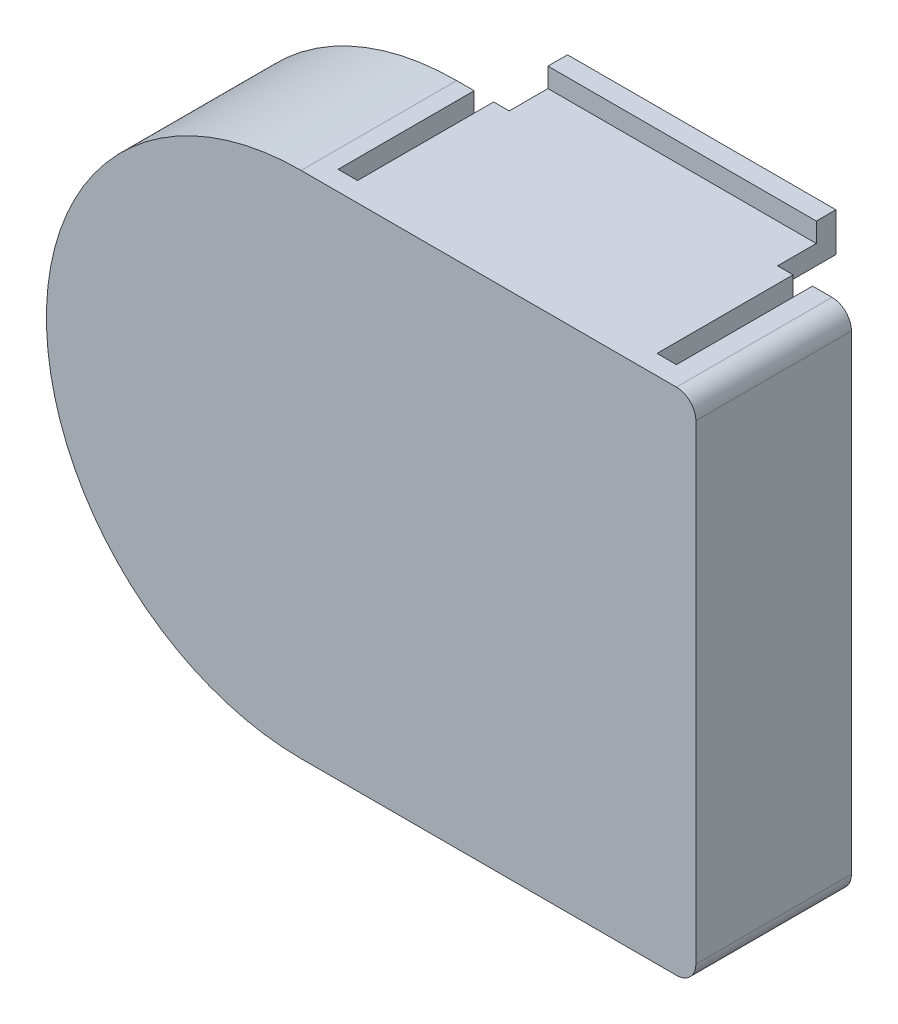
ISO-10303-21;
HEADER;
FILE_DESCRIPTION(('STEP AP214'),'2;1');
FILE_NAME('part.step','',(''),(''),'','','');
FILE_SCHEMA(('AUTOMOTIVE_DESIGN { 1 0 10303 214 1 1 1 1 }'));
ENDSEC;
DATA;
#1=APPLICATION_CONTEXT('core data for automotive mechanical design processes');
#2=APPLICATION_PROTOCOL_DEFINITION('international standard','automotive_design',2000,#1);
#3=PRODUCT_CONTEXT('',#1,'mechanical');
#4=PRODUCT('Part','Part','',(#3));
#5=PRODUCT_RELATED_PRODUCT_CATEGORY('part','',(#4));
#6=PRODUCT_DEFINITION_FORMATION('','',#4);
#7=PRODUCT_DEFINITION_CONTEXT('part definition',#1,'design');
#8=PRODUCT_DEFINITION('design','',#6,#7);
#9=PRODUCT_DEFINITION_SHAPE('','',#8);
#10=(LENGTH_UNIT() NAMED_UNIT(*) SI_UNIT(.MILLI.,.METRE.));
#11=(NAMED_UNIT(*) PLANE_ANGLE_UNIT() SI_UNIT($,.RADIAN.));
#12=(NAMED_UNIT(*) SI_UNIT($,.STERADIAN.) SOLID_ANGLE_UNIT());
#13=UNCERTAINTY_MEASURE_WITH_UNIT(LENGTH_MEASURE(1.E-05),#10,'distance_accuracy_value','');
#14=(GEOMETRIC_REPRESENTATION_CONTEXT(3) GLOBAL_UNCERTAINTY_ASSIGNED_CONTEXT((#13)) GLOBAL_UNIT_ASSIGNED_CONTEXT((#10,
#11,#12)) REPRESENTATION_CONTEXT('',''));
#15=CARTESIAN_POINT('',(0.,0.,0.));
#16=DIRECTION('',(0.,0.,1.));
#17=DIRECTION('',(1.,0.,0.));
#18=AXIS2_PLACEMENT_3D('',#15,#16,#17);
#19=CARTESIAN_POINT('',(21.209,16.637,22.86));
#20=DIRECTION('',(1.,0.,0.));
#21=DIRECTION('',(0.,0.,-1.));
#22=AXIS2_PLACEMENT_3D('',#19,#20,#21);
#23=PLANE('',#22);
#24=DIRECTION('',(0.,0.,-1.));
#25=VECTOR('',#24,1.);
#26=CARTESIAN_POINT('',(21.209,15.367,22.86));
#27=LINE('',#26,#25);
#28=CARTESIAN_POINT('',(21.209,15.367,10.16));
#29=VERTEX_POINT('',#28);
#30=CARTESIAN_POINT('',(21.209,15.367,20.32));
#31=VERTEX_POINT('',#30);
#32=EDGE_CURVE('E299',#29,#31,#27,.F.);
#33=ORIENTED_EDGE('',*,*,#32,.T.);
#34=DIRECTION('',(0.,-1.,0.));
#35=VECTOR('',#34,1.);
#36=CARTESIAN_POINT('',(21.209,16.637,20.32));
#37=LINE('',#36,#35);
#38=CARTESIAN_POINT('',(21.209,-15.367,20.32));
#39=VERTEX_POINT('',#38);
#40=EDGE_CURVE('E50',#31,#39,#37,.T.);
#41=ORIENTED_EDGE('',*,*,#40,.T.);
#42=DIRECTION('',(0.,0.,-1.));
#43=VECTOR('',#42,1.);
#44=CARTESIAN_POINT('',(21.209,-15.367,22.86));
#45=LINE('',#44,#43);
#46=CARTESIAN_POINT('',(21.209,-15.367,10.16));
#47=VERTEX_POINT('',#46);
#48=EDGE_CURVE('E297',#39,#47,#45,.T.);
#49=ORIENTED_EDGE('',*,*,#48,.T.);
#50=DIRECTION('',(0.,-1.,0.));
#51=VECTOR('',#50,1.);
#52=CARTESIAN_POINT('',(21.209,16.637,10.16));
#53=LINE('',#52,#51);
#54=EDGE_CURVE('E366',#29,#47,#53,.T.);
#55=ORIENTED_EDGE('',*,*,#54,.F.);
#56=EDGE_LOOP('',(#33,#41,#49,#55));
#57=FACE_BOUND('',#56,.T.);
#58=ADVANCED_FACE('F35',(#57),#23,.T.);
#59=CARTESIAN_POINT('',(21.209,16.637,22.86));
#60=DIRECTION('',(0.,1.,0.));
#61=DIRECTION('',(0.,0.,1.));
#62=AXIS2_PLACEMENT_3D('',#59,#60,#61);
#63=PLANE('',#62);
#64=DIRECTION('',(0.,0.,-1.));
#65=VECTOR('',#64,1.);
#66=CARTESIAN_POINT('',(-4.57200000000006,16.637,22.86));
#67=LINE('',#66,#65);
#68=CARTESIAN_POINT('',(-4.57200000000006,16.637,20.32));
#69=VERTEX_POINT('',#68);
#70=CARTESIAN_POINT('',(-4.57200000000006,16.637,10.16));
#71=VERTEX_POINT('',#70);
#72=EDGE_CURVE('E286',#69,#71,#67,.T.);
#73=ORIENTED_EDGE('',*,*,#72,.F.);
#74=DIRECTION('',(1.,0.,0.));
#75=VECTOR('',#74,1.);
#76=CARTESIAN_POINT('',(21.209,16.637,20.32));
#77=LINE('',#76,#75);
#78=CARTESIAN_POINT('',(19.939,16.637,20.32));
#79=VERTEX_POINT('',#78);
#80=EDGE_CURVE('E278',#69,#79,#77,.T.);
#81=ORIENTED_EDGE('',*,*,#80,.T.);
#82=DIRECTION('',(0.,0.,-1.));
#83=VECTOR('',#82,1.);
#84=CARTESIAN_POINT('',(19.939,16.637,22.86));
#85=LINE('',#84,#83);
#86=CARTESIAN_POINT('',(19.939,16.637,10.16));
#87=VERTEX_POINT('',#86);
#88=EDGE_CURVE('E43',#79,#87,#85,.T.);
#89=ORIENTED_EDGE('',*,*,#88,.T.);
#90=DIRECTION('',(1.,0.,0.));
#91=VECTOR('',#90,1.);
#92=CARTESIAN_POINT('',(21.209,16.637,10.16));
#93=LINE('',#92,#91);
#94=CARTESIAN_POINT('',(18.669,16.637,10.16));
#95=VERTEX_POINT('',#94);
#96=EDGE_CURVE('E360',#95,#87,#93,.T.);
#97=ORIENTED_EDGE('',*,*,#96,.F.);
#98=DIRECTION('',(0.,0.,-1.));
#99=VECTOR('',#98,1.);
#100=CARTESIAN_POINT('',(18.669,16.637,22.86));
#101=LINE('',#100,#99);
#102=CARTESIAN_POINT('',(18.669,16.637,19.05));
#103=VERTEX_POINT('',#102);
#104=EDGE_CURVE('E466',#103,#95,#101,.T.);
#105=ORIENTED_EDGE('',*,*,#104,.F.);
#106=DIRECTION('',(1.,0.,0.));
#107=VECTOR('',#106,1.);
#108=CARTESIAN_POINT('',(21.209,16.637,19.05));
#109=LINE('',#108,#107);
#110=CARTESIAN_POINT('',(17.399,16.637,19.05));
#111=VERTEX_POINT('',#110);
#112=EDGE_CURVE('E438',#111,#103,#109,.T.);
#113=ORIENTED_EDGE('',*,*,#112,.F.);
#114=DIRECTION('',(0.,0.,1.));
#115=VECTOR('',#114,1.);
#116=CARTESIAN_POINT('',(17.399,16.637,22.86));
#117=LINE('',#116,#115);
#118=CARTESIAN_POINT('',(17.399,16.637,10.16));
#119=VERTEX_POINT('',#118);
#120=EDGE_CURVE('E456',#119,#111,#117,.T.);
#121=ORIENTED_EDGE('',*,*,#120,.F.);
#122=CARTESIAN_POINT('',(16.3829999999999,16.637,10.16));
#123=VERTEX_POINT('',#122);
#124=EDGE_CURVE('E356',#123,#119,#93,.T.);
#125=ORIENTED_EDGE('',*,*,#124,.F.);
#126=DIRECTION('',(0.,0.,-1.));
#127=VECTOR('',#126,1.);
#128=CARTESIAN_POINT('',(16.3829999999999,16.637,0.));
#129=LINE('',#128,#127);
#130=CARTESIAN_POINT('',(16.3829999999999,16.637,7.62868518843452));
#131=VERTEX_POINT('',#130);
#132=EDGE_CURVE('E429',#123,#131,#129,.T.);
#133=ORIENTED_EDGE('',*,*,#132,.T.);
#134=DIRECTION('',(1.,0.,0.));
#135=VECTOR('',#134,1.);
#136=CARTESIAN_POINT('',(-1.14300000000005,16.637,7.62868518843452));
#137=LINE('',#136,#135);
#138=CARTESIAN_POINT('',(-1.14300000000005,16.637,7.62868518843452));
#139=VERTEX_POINT('',#138);
#140=EDGE_CURVE('E397',#139,#131,#137,.T.);
#141=ORIENTED_EDGE('',*,*,#140,.F.);
#142=DIRECTION('',(0.,0.,-1.));
#143=VECTOR('',#142,1.);
#144=CARTESIAN_POINT('',(-1.14300000000005,16.637,0.));
#145=LINE('',#144,#143);
#146=CARTESIAN_POINT('',(-1.14300000000005,16.637,10.16));
#147=VERTEX_POINT('',#146);
#148=EDGE_CURVE('E446',#147,#139,#145,.T.);
#149=ORIENTED_EDGE('',*,*,#148,.F.);
#150=CARTESIAN_POINT('',(-2.15900000000003,16.637,10.16));
#151=VERTEX_POINT('',#150);
#152=EDGE_CURVE('E355',#151,#147,#93,.T.);
#153=ORIENTED_EDGE('',*,*,#152,.F.);
#154=DIRECTION('',(0.,0.,-1.));
#155=VECTOR('',#154,1.);
#156=CARTESIAN_POINT('',(-2.15900000000003,16.637,22.86));
#157=LINE('',#156,#155);
#158=CARTESIAN_POINT('',(-2.15900000000003,16.637,19.05));
#159=VERTEX_POINT('',#158);
#160=EDGE_CURVE('E506',#159,#151,#157,.T.);
#161=ORIENTED_EDGE('',*,*,#160,.F.);
#162=DIRECTION('',(1.,0.,0.));
#163=VECTOR('',#162,1.);
#164=CARTESIAN_POINT('',(21.209,16.637,19.05));
#165=LINE('',#164,#163);
#166=CARTESIAN_POINT('',(-3.42900000000003,16.637,19.05));
#167=VERTEX_POINT('',#166);
#168=EDGE_CURVE('E488',#167,#159,#165,.T.);
#169=ORIENTED_EDGE('',*,*,#168,.F.);
#170=DIRECTION('',(0.,0.,1.));
#171=VECTOR('',#170,1.);
#172=CARTESIAN_POINT('',(-3.42900000000003,16.637,22.86));
#173=LINE('',#172,#171);
#174=CARTESIAN_POINT('',(-3.42900000000003,16.637,10.16));
#175=VERTEX_POINT('',#174);
#176=EDGE_CURVE('E497',#175,#167,#173,.T.);
#177=ORIENTED_EDGE('',*,*,#176,.F.);
#178=EDGE_CURVE('E351',#71,#175,#93,.T.);
#179=ORIENTED_EDGE('',*,*,#178,.F.);
#180=EDGE_LOOP('',(#73,#81,#89,#97,#105,#113,#121,#125,#133,#141,#149,#153,#161,#169,#177,#179));
#181=FACE_BOUND('',#180,.T.);
#182=ADVANCED_FACE('F284',(#181),#63,.T.);
#183=CARTESIAN_POINT('',(-4.572,0.,22.86));
#184=DIRECTION('',(0.,0.,-1.));
#185=DIRECTION('',(-1.,0.,0.));
#186=AXIS2_PLACEMENT_3D('',#183,#184,#185);
#187=CYLINDRICAL_SURFACE('',#186,16.637);
#188=DIRECTION('',(0.,0.,-1.));
#189=VECTOR('',#188,1.);
#190=CARTESIAN_POINT('',(-4.57199999999979,-16.637,22.86));
#191=LINE('',#190,#189);
#192=CARTESIAN_POINT('',(-4.57199999999979,-16.637,20.32));
#193=VERTEX_POINT('',#192);
#194=CARTESIAN_POINT('',(-4.57199999999979,-16.637,10.16));
#195=VERTEX_POINT('',#194);
#196=EDGE_CURVE('E349',#193,#195,#191,.T.);
#197=ORIENTED_EDGE('',*,*,#196,.F.);
#198=CARTESIAN_POINT('',(-4.572,0.,20.32));
#199=DIRECTION('',(0.,0.,1.));
#200=DIRECTION('',(1.,0.,0.));
#201=AXIS2_PLACEMENT_3D('',#198,#199,#200);
#202=CIRCLE('',#201,16.637);
#203=EDGE_CURVE('E522',#193,#69,#202,.F.);
#204=ORIENTED_EDGE('',*,*,#203,.T.);
#205=ORIENTED_EDGE('',*,*,#72,.T.);
#206=CARTESIAN_POINT('',(-4.572,0.,10.16));
#207=DIRECTION('',(0.,0.,-1.));
#208=DIRECTION('',(-1.,0.,0.));
#209=AXIS2_PLACEMENT_3D('',#206,#207,#208);
#210=CIRCLE('',#209,16.637);
#211=EDGE_CURVE('E357',#195,#71,#210,.T.);
#212=ORIENTED_EDGE('',*,*,#211,.F.);
#213=EDGE_LOOP('',(#197,#204,#205,#212));
#214=FACE_BOUND('',#213,.T.);
#215=ADVANCED_FACE('F624',(#214),#187,.T.);
#216=CARTESIAN_POINT('',(21.209,-16.637,22.86));
#217=DIRECTION('',(0.,-1.,0.));
#218=DIRECTION('',(0.,0.,-1.));
#219=AXIS2_PLACEMENT_3D('',#216,#217,#218);
#220=PLANE('',#219);
#221=DIRECTION('',(0.,0.,-1.));
#222=VECTOR('',#221,1.);
#223=CARTESIAN_POINT('',(19.939,-16.637,22.86));
#224=LINE('',#223,#222);
#225=CARTESIAN_POINT('',(19.939,-16.637,10.16));
#226=VERTEX_POINT('',#225);
#227=CARTESIAN_POINT('',(19.939,-16.637,20.32));
#228=VERTEX_POINT('',#227);
#229=EDGE_CURVE('E290',#226,#228,#224,.F.);
#230=ORIENTED_EDGE('',*,*,#229,.T.);
#231=DIRECTION('',(-1.,0.,0.));
#232=VECTOR('',#231,1.);
#233=CARTESIAN_POINT('',(21.209,-16.637,20.32));
#234=LINE('',#233,#232);
#235=EDGE_CURVE('E526',#228,#193,#234,.T.);
#236=ORIENTED_EDGE('',*,*,#235,.T.);
#237=ORIENTED_EDGE('',*,*,#196,.T.);
#238=DIRECTION('',(-1.,0.,0.));
#239=VECTOR('',#238,1.);
#240=CARTESIAN_POINT('',(21.209,-16.637,10.16));
#241=LINE('',#240,#239);
#242=CARTESIAN_POINT('',(-3.42900000000003,-16.637,10.16));
#243=VERTEX_POINT('',#242);
#244=EDGE_CURVE('E364',#243,#195,#241,.T.);
#245=ORIENTED_EDGE('',*,*,#244,.F.);
#246=DIRECTION('',(0.,0.,-1.));
#247=VECTOR('',#246,1.);
#248=CARTESIAN_POINT('',(-3.42900000000003,-16.637,22.86));
#249=LINE('',#248,#247);
#250=CARTESIAN_POINT('',(-3.42900000000003,-16.637,19.05));
#251=VERTEX_POINT('',#250);
#252=EDGE_CURVE('E499',#251,#243,#249,.T.);
#253=ORIENTED_EDGE('',*,*,#252,.F.);
#254=DIRECTION('',(-1.,0.,0.));
#255=VECTOR('',#254,1.);
#256=CARTESIAN_POINT('',(21.209,-16.637,19.05));
#257=LINE('',#256,#255);
#258=CARTESIAN_POINT('',(-2.15900000000003,-16.637,19.05));
#259=VERTEX_POINT('',#258);
#260=EDGE_CURVE('E301',#259,#251,#257,.T.);
#261=ORIENTED_EDGE('',*,*,#260,.F.);
#262=DIRECTION('',(0.,0.,1.));
#263=VECTOR('',#262,1.);
#264=CARTESIAN_POINT('',(-2.15900000000003,-16.637,22.86));
#265=LINE('',#264,#263);
#266=CARTESIAN_POINT('',(-2.15900000000003,-16.637,10.16));
#267=VERTEX_POINT('',#266);
#268=EDGE_CURVE('E508',#267,#259,#265,.T.);
#269=ORIENTED_EDGE('',*,*,#268,.F.);
#270=CARTESIAN_POINT('',(-1.14300000000003,-16.637,10.16));
#271=VERTEX_POINT('',#270);
#272=EDGE_CURVE('E365',#271,#267,#241,.T.);
#273=ORIENTED_EDGE('',*,*,#272,.F.);
#274=DIRECTION('',(0.,0.,-1.));
#275=VECTOR('',#274,1.);
#276=CARTESIAN_POINT('',(-1.14300000000003,-16.637,0.));
#277=LINE('',#276,#275);
#278=CARTESIAN_POINT('',(-1.14300000000003,-16.637,7.62868518843452));
#279=VERTEX_POINT('',#278);
#280=EDGE_CURVE('E402',#271,#279,#277,.T.);
#281=ORIENTED_EDGE('',*,*,#280,.T.);
#282=DIRECTION('',(1.,0.,0.));
#283=VECTOR('',#282,1.);
#284=CARTESIAN_POINT('',(-1.14300000000003,-16.637,7.62868518843452));
#285=LINE('',#284,#283);
#286=CARTESIAN_POINT('',(16.383,-16.637,7.62868518843452));
#287=VERTEX_POINT('',#286);
#288=EDGE_CURVE('E374',#279,#287,#285,.T.);
#289=ORIENTED_EDGE('',*,*,#288,.T.);
#290=DIRECTION('',(0.,0.,-1.));
#291=VECTOR('',#290,1.);
#292=CARTESIAN_POINT('',(16.383,-16.637,0.));
#293=LINE('',#292,#291);
#294=CARTESIAN_POINT('',(16.383,-16.637,10.16));
#295=VERTEX_POINT('',#294);
#296=EDGE_CURVE('E386',#295,#287,#293,.T.);
#297=ORIENTED_EDGE('',*,*,#296,.F.);
#298=CARTESIAN_POINT('',(17.399,-16.637,10.16));
#299=VERTEX_POINT('',#298);
#300=EDGE_CURVE('E363',#299,#295,#241,.T.);
#301=ORIENTED_EDGE('',*,*,#300,.F.);
#302=DIRECTION('',(0.,0.,-1.));
#303=VECTOR('',#302,1.);
#304=CARTESIAN_POINT('',(17.399,-16.637,22.86));
#305=LINE('',#304,#303);
#306=CARTESIAN_POINT('',(17.399,-16.637,19.05));
#307=VERTEX_POINT('',#306);
#308=EDGE_CURVE('E458',#307,#299,#305,.T.);
#309=ORIENTED_EDGE('',*,*,#308,.F.);
#310=DIRECTION('',(-1.,0.,0.));
#311=VECTOR('',#310,1.);
#312=CARTESIAN_POINT('',(21.209,-16.637,19.05));
#313=LINE('',#312,#311);
#314=CARTESIAN_POINT('',(18.669,-16.637,19.05));
#315=VERTEX_POINT('',#314);
#316=EDGE_CURVE('E454',#315,#307,#313,.T.);
#317=ORIENTED_EDGE('',*,*,#316,.F.);
#318=DIRECTION('',(0.,0.,1.));
#319=VECTOR('',#318,1.);
#320=CARTESIAN_POINT('',(18.669,-16.637,22.86));
#321=LINE('',#320,#319);
#322=CARTESIAN_POINT('',(18.669,-16.637,10.16));
#323=VERTEX_POINT('',#322);
#324=EDGE_CURVE('E468',#323,#315,#321,.T.);
#325=ORIENTED_EDGE('',*,*,#324,.F.);
#326=EDGE_CURVE('E361',#226,#323,#241,.T.);
#327=ORIENTED_EDGE('',*,*,#326,.F.);
#328=EDGE_LOOP('',(#230,#236,#237,#245,#253,#261,#269,#273,#281,#289,#297,#301,#309,#317,#325,#327));
#329=FACE_BOUND('',#328,.T.);
#330=ADVANCED_FACE('F628',(#329),#220,.T.);
#331=CARTESIAN_POINT('',(19.939,-15.367,22.86));
#332=DIRECTION('',(0.,0.,-1.));
#333=DIRECTION('',(-1.,0.,0.));
#334=AXIS2_PLACEMENT_3D('',#331,#332,#333);
#335=CYLINDRICAL_SURFACE('',#334,1.27);
#336=ORIENTED_EDGE('',*,*,#48,.F.);
#337=CARTESIAN_POINT('',(19.939,-15.367,20.32));
#338=DIRECTION('',(0.,0.,1.));
#339=DIRECTION('',(1.,0.,0.));
#340=AXIS2_PLACEMENT_3D('',#337,#338,#339);
#341=CIRCLE('',#340,1.27);
#342=EDGE_CURVE('E529',#39,#228,#341,.F.);
#343=ORIENTED_EDGE('',*,*,#342,.T.);
#344=ORIENTED_EDGE('',*,*,#229,.F.);
#345=CARTESIAN_POINT('',(19.939,-15.367,10.16));
#346=DIRECTION('',(0.,0.,1.));
#347=DIRECTION('',(1.,0.,0.));
#348=AXIS2_PLACEMENT_3D('',#345,#346,#347);
#349=CIRCLE('',#348,1.27);
#350=EDGE_CURVE('E292',#47,#226,#349,.F.);
#351=ORIENTED_EDGE('',*,*,#350,.F.);
#352=EDGE_LOOP('',(#336,#343,#344,#351));
#353=FACE_BOUND('',#352,.T.);
#354=ADVANCED_FACE('F537',(#353),#335,.T.);
#355=CARTESIAN_POINT('',(19.939,15.367,22.86));
#356=DIRECTION('',(0.,0.,-1.));
#357=DIRECTION('',(-1.,0.,0.));
#358=AXIS2_PLACEMENT_3D('',#355,#356,#357);
#359=CYLINDRICAL_SURFACE('',#358,1.27);
#360=ORIENTED_EDGE('',*,*,#88,.F.);
#361=CARTESIAN_POINT('',(19.939,15.367,20.32));
#362=DIRECTION('',(0.,0.,1.));
#363=DIRECTION('',(1.,0.,0.));
#364=AXIS2_PLACEMENT_3D('',#361,#362,#363);
#365=CIRCLE('',#364,1.27);
#366=EDGE_CURVE('E11',#79,#31,#365,.F.);
#367=ORIENTED_EDGE('',*,*,#366,.T.);
#368=ORIENTED_EDGE('',*,*,#32,.F.);
#369=CARTESIAN_POINT('',(19.939,15.367,10.16));
#370=DIRECTION('',(0.,0.,1.));
#371=DIRECTION('',(1.,0.,0.));
#372=AXIS2_PLACEMENT_3D('',#369,#370,#371);
#373=CIRCLE('',#372,1.27);
#374=EDGE_CURVE('E288',#87,#29,#373,.F.);
#375=ORIENTED_EDGE('',*,*,#374,.F.);
#376=EDGE_LOOP('',(#360,#367,#368,#375));
#377=FACE_BOUND('',#376,.T.);
#378=ADVANCED_FACE('F37',(#377),#359,.T.);
#379=CARTESIAN_POINT('',(0.,15.367,19.05));
#380=DIRECTION('',(0.,1.,0.));
#381=DIRECTION('',(0.,0.,1.));
#382=AXIS2_PLACEMENT_3D('',#379,#380,#381);
#383=PLANE('',#382);
#384=DIRECTION('',(1.,0.,0.));
#385=VECTOR('',#384,1.);
#386=CARTESIAN_POINT('',(0.,15.367,10.16));
#387=LINE('',#386,#385);
#388=CARTESIAN_POINT('',(-4.57200000000005,15.367,10.16));
#389=VERTEX_POINT('',#388);
#390=CARTESIAN_POINT('',(-3.42900000000003,15.367,10.16));
#391=VERTEX_POINT('',#390);
#392=EDGE_CURVE('E304',#389,#391,#387,.T.);
#393=ORIENTED_EDGE('',*,*,#392,.T.);
#394=DIRECTION('',(0.,0.,1.));
#395=VECTOR('',#394,1.);
#396=CARTESIAN_POINT('',(-3.42900000000003,15.367,19.05));
#397=LINE('',#396,#395);
#398=CARTESIAN_POINT('',(-3.42900000000003,15.367,19.05));
#399=VERTEX_POINT('',#398);
#400=EDGE_CURVE('E492',#391,#399,#397,.T.);
#401=ORIENTED_EDGE('',*,*,#400,.T.);
#402=DIRECTION('',(1.,0.,0.));
#403=VECTOR('',#402,1.);
#404=CARTESIAN_POINT('',(0.,15.367,19.05));
#405=LINE('',#404,#403);
#406=CARTESIAN_POINT('',(-4.57200000000005,15.367,19.05));
#407=VERTEX_POINT('',#406);
#408=EDGE_CURVE('E341',#407,#399,#405,.T.);
#409=ORIENTED_EDGE('',*,*,#408,.F.);
#410=DIRECTION('',(0.,0.,-1.));
#411=VECTOR('',#410,1.);
#412=CARTESIAN_POINT('',(-4.57200000000005,15.367,19.05));
#413=LINE('',#412,#411);
#414=EDGE_CURVE('E320',#407,#389,#413,.T.);
#415=ORIENTED_EDGE('',*,*,#414,.T.);
#416=EDGE_LOOP('',(#393,#401,#409,#415));
#417=FACE_BOUND('',#416,.T.);
#418=ADVANCED_FACE('F644',(#417),#383,.F.);
#419=CARTESIAN_POINT('',(0.,-15.367,19.05));
#420=DIRECTION('',(0.,1.,0.));
#421=DIRECTION('',(-1.,0.,0.));
#422=AXIS2_PLACEMENT_3D('',#419,#420,#421);
#423=PLANE('',#422);
#424=DIRECTION('',(0.,0.,1.));
#425=VECTOR('',#424,1.);
#426=CARTESIAN_POINT('',(-3.42900000000003,-15.367,19.05));
#427=LINE('',#426,#425);
#428=CARTESIAN_POINT('',(-3.42900000000003,-15.367,10.16));
#429=VERTEX_POINT('',#428);
#430=CARTESIAN_POINT('',(-3.42900000000003,-15.367,19.05));
#431=VERTEX_POINT('',#430);
#432=EDGE_CURVE('E495',#429,#431,#427,.T.);
#433=ORIENTED_EDGE('',*,*,#432,.F.);
#434=DIRECTION('',(1.,0.,0.));
#435=VECTOR('',#434,1.);
#436=CARTESIAN_POINT('',(0.,-15.367,10.16));
#437=LINE('',#436,#435);
#438=CARTESIAN_POINT('',(-4.57199999999983,-15.367,10.16));
#439=VERTEX_POINT('',#438);
#440=EDGE_CURVE('E303',#439,#429,#437,.T.);
#441=ORIENTED_EDGE('',*,*,#440,.F.);
#442=DIRECTION('',(0.,0.,-1.));
#443=VECTOR('',#442,1.);
#444=CARTESIAN_POINT('',(-4.57199999999983,-15.367,19.05));
#445=LINE('',#444,#443);
#446=CARTESIAN_POINT('',(-4.57199999999983,-15.367,19.05));
#447=VERTEX_POINT('',#446);
#448=EDGE_CURVE('E330',#447,#439,#445,.T.);
#449=ORIENTED_EDGE('',*,*,#448,.F.);
#450=DIRECTION('',(1.,0.,0.));
#451=VECTOR('',#450,1.);
#452=CARTESIAN_POINT('',(0.,-15.367,19.05));
#453=LINE('',#452,#451);
#454=EDGE_CURVE('E333',#447,#431,#453,.T.);
#455=ORIENTED_EDGE('',*,*,#454,.T.);
#456=EDGE_LOOP('',(#433,#441,#449,#455));
#457=FACE_BOUND('',#456,.T.);
#458=ADVANCED_FACE('F637',(#457),#423,.T.);
#459=CARTESIAN_POINT('',(0.,0.,10.16));
#460=DIRECTION('',(0.,0.,1.));
#461=DIRECTION('',(1.,0.,0.));
#462=AXIS2_PLACEMENT_3D('',#459,#460,#461);
#463=PLANE('',#462);
#464=ORIENTED_EDGE('',*,*,#178,.T.);
#465=DIRECTION('',(0.,1.,0.));
#466=VECTOR('',#465,1.);
#467=CARTESIAN_POINT('',(-3.42900000000003,-17.9736463919661,10.16));
#468=LINE('',#467,#466);
#469=EDGE_CURVE('E523',#391,#175,#468,.T.);
#470=ORIENTED_EDGE('',*,*,#469,.F.);
#471=ORIENTED_EDGE('',*,*,#392,.F.);
#472=CARTESIAN_POINT('',(-4.572,0.,10.16));
#473=DIRECTION('',(0.,0.,1.));
#474=DIRECTION('',(1.,0.,0.));
#475=AXIS2_PLACEMENT_3D('',#472,#473,#474);
#476=CIRCLE('',#475,15.367);
#477=EDGE_CURVE('E312',#389,#439,#476,.T.);
#478=ORIENTED_EDGE('',*,*,#477,.T.);
#479=ORIENTED_EDGE('',*,*,#440,.T.);
#480=EDGE_CURVE('E515',#243,#429,#468,.T.);
#481=ORIENTED_EDGE('',*,*,#480,.F.);
#482=ORIENTED_EDGE('',*,*,#244,.T.);
#483=ORIENTED_EDGE('',*,*,#211,.T.);
#484=EDGE_LOOP('',(#464,#470,#471,#478,#479,#481,#482,#483));
#485=FACE_BOUND('',#484,.T.);
#486=ADVANCED_FACE('F649',(#485),#463,.F.);
#487=ORIENTED_EDGE('',*,*,#272,.T.);
#488=DIRECTION('',(0.,-1.,0.));
#489=VECTOR('',#488,1.);
#490=CARTESIAN_POINT('',(-2.15900000000003,-17.9736463919661,10.16));
#491=LINE('',#490,#489);
#492=CARTESIAN_POINT('',(-2.15900000000003,-15.367,10.16));
#493=VERTEX_POINT('',#492);
#494=EDGE_CURVE('E519',#493,#267,#491,.T.);
#495=ORIENTED_EDGE('',*,*,#494,.F.);
#496=CARTESIAN_POINT('',(-1.14300000000003,-15.367,10.16));
#497=VERTEX_POINT('',#496);
#498=EDGE_CURVE('E318',#493,#497,#437,.T.);
#499=ORIENTED_EDGE('',*,*,#498,.T.);
#500=DIRECTION('',(0.,-1.,0.));
#501=VECTOR('',#500,1.);
#502=CARTESIAN_POINT('',(-1.14300000000004,0.,10.16));
#503=LINE('',#502,#501);
#504=EDGE_CURVE('E399',#497,#271,#503,.T.);
#505=ORIENTED_EDGE('',*,*,#504,.T.);
#506=EDGE_LOOP('',(#487,#495,#499,#505));
#507=FACE_BOUND('',#506,.T.);
#508=ADVANCED_FACE('F671',(#507),#463,.F.);
#509=CARTESIAN_POINT('',(16.383,-15.367,10.16));
#510=VERTEX_POINT('',#509);
#511=CARTESIAN_POINT('',(17.399,-15.367,10.16));
#512=VERTEX_POINT('',#511);
#513=EDGE_CURVE('E319',#510,#512,#437,.T.);
#514=ORIENTED_EDGE('',*,*,#513,.T.);
#515=DIRECTION('',(0.,1.,0.));
#516=VECTOR('',#515,1.);
#517=CARTESIAN_POINT('',(17.399,-17.433266047151,10.16));
#518=LINE('',#517,#516);
#519=EDGE_CURVE('E480',#299,#512,#518,.T.);
#520=ORIENTED_EDGE('',*,*,#519,.F.);
#521=ORIENTED_EDGE('',*,*,#300,.T.);
#522=DIRECTION('',(0.,-1.,0.));
#523=VECTOR('',#522,1.);
#524=CARTESIAN_POINT('',(16.383,0.,10.16));
#525=LINE('',#524,#523);
#526=EDGE_CURVE('E383',#510,#295,#525,.T.);
#527=ORIENTED_EDGE('',*,*,#526,.F.);
#528=EDGE_LOOP('',(#514,#520,#521,#527));
#529=FACE_BOUND('',#528,.T.);
#530=ADVANCED_FACE('F716',(#529),#463,.F.);
#531=ORIENTED_EDGE('',*,*,#124,.T.);
#532=CARTESIAN_POINT('',(17.399,15.367,10.16));
#533=VERTEX_POINT('',#532);
#534=EDGE_CURVE('E489',#533,#119,#518,.T.);
#535=ORIENTED_EDGE('',*,*,#534,.F.);
#536=CARTESIAN_POINT('',(16.3829999999999,15.367,10.16));
#537=VERTEX_POINT('',#536);
#538=EDGE_CURVE('E309',#537,#533,#387,.T.);
#539=ORIENTED_EDGE('',*,*,#538,.F.);
#540=DIRECTION('',(0.,1.,0.));
#541=VECTOR('',#540,1.);
#542=CARTESIAN_POINT('',(16.383,0.,10.16));
#543=LINE('',#542,#541);
#544=EDGE_CURVE('E432',#537,#123,#543,.T.);
#545=ORIENTED_EDGE('',*,*,#544,.T.);
#546=EDGE_LOOP('',(#531,#535,#539,#545));
#547=FACE_BOUND('',#546,.T.);
#548=ADVANCED_FACE('F604',(#547),#463,.F.);
#549=CARTESIAN_POINT('',(-2.15900000000003,15.367,19.05));
#550=VERTEX_POINT('',#549);
#551=CARTESIAN_POINT('',(17.399,15.367,19.05));
#552=VERTEX_POINT('',#551);
#553=EDGE_CURVE('E344',#550,#552,#405,.T.);
#554=ORIENTED_EDGE('',*,*,#553,.F.);
#555=DIRECTION('',(0.,0.,-1.));
#556=VECTOR('',#555,1.);
#557=CARTESIAN_POINT('',(-2.15900000000003,15.367,19.05));
#558=LINE('',#557,#556);
#559=CARTESIAN_POINT('',(-2.15900000000003,15.367,10.16));
#560=VERTEX_POINT('',#559);
#561=EDGE_CURVE('E501',#550,#560,#558,.T.);
#562=ORIENTED_EDGE('',*,*,#561,.T.);
#563=CARTESIAN_POINT('',(-1.14300000000005,15.367,10.16));
#564=VERTEX_POINT('',#563);
#565=EDGE_CURVE('E308',#560,#564,#387,.T.);
#566=ORIENTED_EDGE('',*,*,#565,.T.);
#567=DIRECTION('',(0.,0.,-1.));
#568=VECTOR('',#567,1.);
#569=CARTESIAN_POINT('',(-1.14300000000005,15.367,0.));
#570=LINE('',#569,#568);
#571=CARTESIAN_POINT('',(-1.14300000000005,15.367,6.35));
#572=VERTEX_POINT('',#571);
#573=EDGE_CURVE('E422',#564,#572,#570,.T.);
#574=ORIENTED_EDGE('',*,*,#573,.T.);
#575=DIRECTION('',(1.,0.,0.));
#576=VECTOR('',#575,1.);
#577=CARTESIAN_POINT('',(-1.14300000000005,15.367,6.35));
#578=LINE('',#577,#576);
#579=CARTESIAN_POINT('',(16.3829999999999,15.367,6.35));
#580=VERTEX_POINT('',#579);
#581=EDGE_CURVE('E416',#572,#580,#578,.T.);
#582=ORIENTED_EDGE('',*,*,#581,.T.);
#583=DIRECTION('',(0.,0.,-1.));
#584=VECTOR('',#583,1.);
#585=CARTESIAN_POINT('',(16.3829999999999,15.367,0.));
#586=LINE('',#585,#584);
#587=EDGE_CURVE('E435',#537,#580,#586,.T.);
#588=ORIENTED_EDGE('',*,*,#587,.F.);
#589=ORIENTED_EDGE('',*,*,#538,.T.);
#590=DIRECTION('',(0.,0.,1.));
#591=VECTOR('',#590,1.);
#592=CARTESIAN_POINT('',(17.399,15.367,19.05));
#593=LINE('',#592,#591);
#594=EDGE_CURVE('E460',#533,#552,#593,.T.);
#595=ORIENTED_EDGE('',*,*,#594,.T.);
#596=EDGE_LOOP('',(#554,#562,#566,#574,#582,#588,#589,#595));
#597=FACE_BOUND('',#596,.T.);
#598=ADVANCED_FACE('F575',(#597),#383,.F.);
#599=DIRECTION('',(0.,0.,-1.));
#600=VECTOR('',#599,1.);
#601=CARTESIAN_POINT('',(-2.15900000000003,-15.367,19.05));
#602=LINE('',#601,#600);
#603=CARTESIAN_POINT('',(-2.15900000000003,-15.367,19.05));
#604=VERTEX_POINT('',#603);
#605=EDGE_CURVE('E504',#604,#493,#602,.T.);
#606=ORIENTED_EDGE('',*,*,#605,.F.);
#607=CARTESIAN_POINT('',(17.399,-15.367,19.05));
#608=VERTEX_POINT('',#607);
#609=EDGE_CURVE('E336',#604,#608,#453,.T.);
#610=ORIENTED_EDGE('',*,*,#609,.T.);
#611=DIRECTION('',(0.,0.,1.));
#612=VECTOR('',#611,1.);
#613=CARTESIAN_POINT('',(17.399,-15.367,19.05));
#614=LINE('',#613,#612);
#615=EDGE_CURVE('E463',#512,#608,#614,.T.);
#616=ORIENTED_EDGE('',*,*,#615,.F.);
#617=ORIENTED_EDGE('',*,*,#513,.F.);
#618=DIRECTION('',(0.,0.,-1.));
#619=VECTOR('',#618,1.);
#620=CARTESIAN_POINT('',(16.383,-15.367,0.));
#621=LINE('',#620,#619);
#622=CARTESIAN_POINT('',(16.383,-15.367,6.35000000000001));
#623=VERTEX_POINT('',#622);
#624=EDGE_CURVE('E379',#510,#623,#621,.T.);
#625=ORIENTED_EDGE('',*,*,#624,.T.);
#626=DIRECTION('',(1.,0.,0.));
#627=VECTOR('',#626,1.);
#628=CARTESIAN_POINT('',(-1.14300000000003,-15.367,6.35000000000001));
#629=LINE('',#628,#627);
#630=CARTESIAN_POINT('',(-1.14300000000003,-15.367,6.35000000000001));
#631=VERTEX_POINT('',#630);
#632=EDGE_CURVE('E376',#631,#623,#629,.T.);
#633=ORIENTED_EDGE('',*,*,#632,.F.);
#634=DIRECTION('',(0.,0.,-1.));
#635=VECTOR('',#634,1.);
#636=CARTESIAN_POINT('',(-1.14300000000003,-15.367,0.));
#637=LINE('',#636,#635);
#638=EDGE_CURVE('E378',#497,#631,#637,.T.);
#639=ORIENTED_EDGE('',*,*,#638,.F.);
#640=ORIENTED_EDGE('',*,*,#498,.F.);
#641=EDGE_LOOP('',(#606,#610,#616,#617,#625,#633,#639,#640));
#642=FACE_BOUND('',#641,.T.);
#643=ADVANCED_FACE('F638',(#642),#423,.T.);
#644=ORIENTED_EDGE('',*,*,#54,.T.);
#645=ORIENTED_EDGE('',*,*,#350,.T.);
#646=ORIENTED_EDGE('',*,*,#326,.T.);
#647=DIRECTION('',(0.,-1.,0.));
#648=VECTOR('',#647,1.);
#649=CARTESIAN_POINT('',(18.669,-17.433266047151,10.16));
#650=LINE('',#649,#648);
#651=CARTESIAN_POINT('',(18.669,-15.367,10.16));
#652=VERTEX_POINT('',#651);
#653=EDGE_CURVE('E484',#652,#323,#650,.T.);
#654=ORIENTED_EDGE('',*,*,#653,.F.);
#655=CARTESIAN_POINT('',(19.939,-15.367,10.16));
#656=VERTEX_POINT('',#655);
#657=EDGE_CURVE('E315',#652,#656,#437,.T.);
#658=ORIENTED_EDGE('',*,*,#657,.T.);
#659=DIRECTION('',(0.,-1.,0.));
#660=VECTOR('',#659,1.);
#661=CARTESIAN_POINT('',(19.939,0.,10.16));
#662=LINE('',#661,#660);
#663=CARTESIAN_POINT('',(19.939,15.367,10.16));
#664=VERTEX_POINT('',#663);
#665=EDGE_CURVE('E307',#664,#656,#662,.T.);
#666=ORIENTED_EDGE('',*,*,#665,.F.);
#667=CARTESIAN_POINT('',(18.669,15.367,10.16));
#668=VERTEX_POINT('',#667);
#669=EDGE_CURVE('E323',#668,#664,#387,.T.);
#670=ORIENTED_EDGE('',*,*,#669,.F.);
#671=EDGE_CURVE('E487',#95,#668,#650,.T.);
#672=ORIENTED_EDGE('',*,*,#671,.F.);
#673=ORIENTED_EDGE('',*,*,#96,.T.);
#674=ORIENTED_EDGE('',*,*,#374,.T.);
#675=EDGE_LOOP('',(#644,#645,#646,#654,#658,#666,#670,#672,#673,#674));
#676=FACE_BOUND('',#675,.T.);
#677=ADVANCED_FACE('F541',(#676),#463,.F.);
#678=ORIENTED_EDGE('',*,*,#565,.F.);
#679=EDGE_CURVE('E521',#151,#560,#491,.T.);
#680=ORIENTED_EDGE('',*,*,#679,.F.);
#681=ORIENTED_EDGE('',*,*,#152,.T.);
#682=DIRECTION('',(0.,1.,0.));
#683=VECTOR('',#682,1.);
#684=CARTESIAN_POINT('',(-1.14300000000004,0.,10.16));
#685=LINE('',#684,#683);
#686=EDGE_CURVE('E448',#564,#147,#685,.T.);
#687=ORIENTED_EDGE('',*,*,#686,.F.);
#688=EDGE_LOOP('',(#678,#680,#681,#687));
#689=FACE_BOUND('',#688,.T.);
#690=ADVANCED_FACE('F551',(#689),#463,.F.);
#691=CARTESIAN_POINT('',(19.939,0.,19.05));
#692=DIRECTION('',(1.,0.,0.));
#693=DIRECTION('',(0.,1.,0.));
#694=AXIS2_PLACEMENT_3D('',#691,#692,#693);
#695=PLANE('',#694);
#696=DIRECTION('',(0.,0.,-1.));
#697=VECTOR('',#696,1.);
#698=CARTESIAN_POINT('',(19.939,15.367,19.05));
#699=LINE('',#698,#697);
#700=CARTESIAN_POINT('',(19.939,15.367,19.05));
#701=VERTEX_POINT('',#700);
#702=EDGE_CURVE('E324',#701,#664,#699,.T.);
#703=ORIENTED_EDGE('',*,*,#702,.T.);
#704=ORIENTED_EDGE('',*,*,#665,.T.);
#705=DIRECTION('',(0.,0.,-1.));
#706=VECTOR('',#705,1.);
#707=CARTESIAN_POINT('',(19.939,-15.367,19.05));
#708=LINE('',#707,#706);
#709=CARTESIAN_POINT('',(19.939,-15.367,19.05));
#710=VERTEX_POINT('',#709);
#711=EDGE_CURVE('E327',#710,#656,#708,.T.);
#712=ORIENTED_EDGE('',*,*,#711,.F.);
#713=DIRECTION('',(0.,-1.,0.));
#714=VECTOR('',#713,1.);
#715=CARTESIAN_POINT('',(19.939,0.,19.05));
#716=LINE('',#715,#714);
#717=EDGE_CURVE('E338',#701,#710,#716,.T.);
#718=ORIENTED_EDGE('',*,*,#717,.F.);
#719=EDGE_LOOP('',(#703,#704,#712,#718));
#720=FACE_BOUND('',#719,.T.);
#721=ADVANCED_FACE('F587',(#720),#695,.F.);
#722=CARTESIAN_POINT('',(-4.572,0.,19.05));
#723=DIRECTION('',(0.,0.,-1.));
#724=DIRECTION('',(-1.,0.,0.));
#725=AXIS2_PLACEMENT_3D('',#722,#723,#724);
#726=CYLINDRICAL_SURFACE('',#725,15.367);
#727=ORIENTED_EDGE('',*,*,#477,.F.);
#728=ORIENTED_EDGE('',*,*,#414,.F.);
#729=CARTESIAN_POINT('',(-4.572,0.,19.05));
#730=DIRECTION('',(0.,0.,1.));
#731=DIRECTION('',(1.,0.,0.));
#732=AXIS2_PLACEMENT_3D('',#729,#730,#731);
#733=CIRCLE('',#732,15.367);
#734=EDGE_CURVE('E346',#407,#447,#733,.T.);
#735=ORIENTED_EDGE('',*,*,#734,.T.);
#736=ORIENTED_EDGE('',*,*,#448,.T.);
#737=EDGE_LOOP('',(#727,#728,#735,#736));
#738=FACE_BOUND('',#737,.T.);
#739=ADVANCED_FACE('F641',(#738),#726,.F.);
#740=CARTESIAN_POINT('',(18.669,15.367,19.05));
#741=VERTEX_POINT('',#740);
#742=EDGE_CURVE('E345',#741,#701,#405,.T.);
#743=ORIENTED_EDGE('',*,*,#742,.F.);
#744=DIRECTION('',(0.,0.,-1.));
#745=VECTOR('',#744,1.);
#746=CARTESIAN_POINT('',(18.669,15.367,19.05));
#747=LINE('',#746,#745);
#748=EDGE_CURVE('E470',#741,#668,#747,.T.);
#749=ORIENTED_EDGE('',*,*,#748,.T.);
#750=ORIENTED_EDGE('',*,*,#669,.T.);
#751=ORIENTED_EDGE('',*,*,#702,.F.);
#752=EDGE_LOOP('',(#743,#749,#750,#751));
#753=FACE_BOUND('',#752,.T.);
#754=ADVANCED_FACE('F581',(#753),#383,.F.);
#755=DIRECTION('',(0.,0.,-1.));
#756=VECTOR('',#755,1.);
#757=CARTESIAN_POINT('',(18.669,-15.367,19.05));
#758=LINE('',#757,#756);
#759=CARTESIAN_POINT('',(18.669,-15.367,19.05));
#760=VERTEX_POINT('',#759);
#761=EDGE_CURVE('E473',#760,#652,#758,.T.);
#762=ORIENTED_EDGE('',*,*,#761,.F.);
#763=EDGE_CURVE('E337',#760,#710,#453,.T.);
#764=ORIENTED_EDGE('',*,*,#763,.T.);
#765=ORIENTED_EDGE('',*,*,#711,.T.);
#766=ORIENTED_EDGE('',*,*,#657,.F.);
#767=EDGE_LOOP('',(#762,#764,#765,#766));
#768=FACE_BOUND('',#767,.T.);
#769=ADVANCED_FACE('F633',(#768),#423,.T.);
#770=CARTESIAN_POINT('',(0.,0.,19.05));
#771=DIRECTION('',(0.,0.,1.));
#772=DIRECTION('',(1.,0.,0.));
#773=AXIS2_PLACEMENT_3D('',#770,#771,#772);
#774=PLANE('',#773);
#775=ORIENTED_EDGE('',*,*,#609,.F.);
#776=DIRECTION('',(0.,-1.,0.));
#777=VECTOR('',#776,1.);
#778=CARTESIAN_POINT('',(-2.15900000000003,-17.9736463919661,19.05));
#779=LINE('',#778,#777);
#780=EDGE_CURVE('E516',#604,#259,#779,.T.);
#781=ORIENTED_EDGE('',*,*,#780,.T.);
#782=ORIENTED_EDGE('',*,*,#260,.T.);
#783=DIRECTION('',(0.,1.,0.));
#784=VECTOR('',#783,1.);
#785=CARTESIAN_POINT('',(-3.42900000000003,-17.9736463919661,19.05));
#786=LINE('',#785,#784);
#787=EDGE_CURVE('E514',#251,#431,#786,.T.);
#788=ORIENTED_EDGE('',*,*,#787,.T.);
#789=ORIENTED_EDGE('',*,*,#454,.F.);
#790=ORIENTED_EDGE('',*,*,#734,.F.);
#791=ORIENTED_EDGE('',*,*,#408,.T.);
#792=EDGE_CURVE('E511',#399,#167,#786,.T.);
#793=ORIENTED_EDGE('',*,*,#792,.T.);
#794=ORIENTED_EDGE('',*,*,#168,.T.);
#795=EDGE_CURVE('E510',#159,#550,#779,.T.);
#796=ORIENTED_EDGE('',*,*,#795,.T.);
#797=ORIENTED_EDGE('',*,*,#553,.T.);
#798=DIRECTION('',(0.,1.,0.));
#799=VECTOR('',#798,1.);
#800=CARTESIAN_POINT('',(17.399,-17.433266047151,19.05));
#801=LINE('',#800,#799);
#802=EDGE_CURVE('E476',#552,#111,#801,.T.);
#803=ORIENTED_EDGE('',*,*,#802,.T.);
#804=ORIENTED_EDGE('',*,*,#112,.T.);
#805=DIRECTION('',(0.,-1.,0.));
#806=VECTOR('',#805,1.);
#807=CARTESIAN_POINT('',(18.669,-17.433266047151,19.05));
#808=LINE('',#807,#806);
#809=EDGE_CURVE('E475',#103,#741,#808,.T.);
#810=ORIENTED_EDGE('',*,*,#809,.T.);
#811=ORIENTED_EDGE('',*,*,#742,.T.);
#812=ORIENTED_EDGE('',*,*,#717,.T.);
#813=ORIENTED_EDGE('',*,*,#763,.F.);
#814=EDGE_CURVE('E481',#760,#315,#808,.T.);
#815=ORIENTED_EDGE('',*,*,#814,.T.);
#816=ORIENTED_EDGE('',*,*,#316,.T.);
#817=EDGE_CURVE('E479',#307,#608,#801,.T.);
#818=ORIENTED_EDGE('',*,*,#817,.T.);
#819=EDGE_LOOP('',(#775,#781,#782,#788,#789,#790,#791,#793,#794,#796,#797,#803,#804,#810,#811,
#812,#813,#815,#816,#818));
#820=FACE_BOUND('',#819,.T.);
#821=ADVANCED_FACE('F591',(#820),#774,.F.);
#822=CARTESIAN_POINT('',(-1.14300000000004,0.,6.35));
#823=DIRECTION('',(0.,0.,-1.));
#824=DIRECTION('',(0.,1.,0.));
#825=AXIS2_PLACEMENT_3D('',#822,#823,#824);
#826=PLANE('',#825);
#827=DIRECTION('',(0.,1.,0.));
#828=VECTOR('',#827,1.);
#829=CARTESIAN_POINT('',(16.383,0.,6.35));
#830=LINE('',#829,#828);
#831=CARTESIAN_POINT('',(16.383,-17.907,6.35000000000001));
#832=VERTEX_POINT('',#831);
#833=EDGE_CURVE('E394',#832,#623,#830,.T.);
#834=ORIENTED_EDGE('',*,*,#833,.F.);
#835=DIRECTION('',(1.,0.,0.));
#836=VECTOR('',#835,1.);
#837=CARTESIAN_POINT('',(-1.14300000000003,-17.907,6.35000000000001));
#838=LINE('',#837,#836);
#839=CARTESIAN_POINT('',(-1.14300000000003,-17.907,6.35000000000001));
#840=VERTEX_POINT('',#839);
#841=EDGE_CURVE('E369',#840,#832,#838,.T.);
#842=ORIENTED_EDGE('',*,*,#841,.F.);
#843=DIRECTION('',(0.,1.,0.));
#844=VECTOR('',#843,1.);
#845=CARTESIAN_POINT('',(-1.14300000000004,0.,6.35));
#846=LINE('',#845,#844);
#847=EDGE_CURVE('E382',#840,#631,#846,.T.);
#848=ORIENTED_EDGE('',*,*,#847,.T.);
#849=ORIENTED_EDGE('',*,*,#632,.T.);
#850=EDGE_LOOP('',(#834,#842,#848,#849));
#851=FACE_BOUND('',#850,.T.);
#852=ADVANCED_FACE('F632',(#851),#826,.T.);
#853=CARTESIAN_POINT('',(-1.14300000000003,-17.907,0.));
#854=DIRECTION('',(0.,1.,0.));
#855=DIRECTION('',(-1.,0.,0.));
#856=AXIS2_PLACEMENT_3D('',#853,#854,#855);
#857=PLANE('',#856);
#858=DIRECTION('',(0.,0.,1.));
#859=VECTOR('',#858,1.);
#860=CARTESIAN_POINT('',(16.383,-17.907,0.));
#861=LINE('',#860,#859);
#862=CARTESIAN_POINT('',(16.383,-17.907,7.62868518843452));
#863=VERTEX_POINT('',#862);
#864=EDGE_CURVE('E392',#832,#863,#861,.T.);
#865=ORIENTED_EDGE('',*,*,#864,.T.);
#866=DIRECTION('',(1.,0.,0.));
#867=VECTOR('',#866,1.);
#868=CARTESIAN_POINT('',(-1.14300000000003,-17.907,7.62868518843452));
#869=LINE('',#868,#867);
#870=CARTESIAN_POINT('',(-1.14300000000003,-17.907,7.62868518843452));
#871=VERTEX_POINT('',#870);
#872=EDGE_CURVE('E371',#871,#863,#869,.T.);
#873=ORIENTED_EDGE('',*,*,#872,.F.);
#874=DIRECTION('',(0.,0.,1.));
#875=VECTOR('',#874,1.);
#876=CARTESIAN_POINT('',(-1.14300000000003,-17.907,0.));
#877=LINE('',#876,#875);
#878=EDGE_CURVE('E407',#840,#871,#877,.T.);
#879=ORIENTED_EDGE('',*,*,#878,.F.);
#880=ORIENTED_EDGE('',*,*,#841,.T.);
#881=EDGE_LOOP('',(#865,#873,#879,#880));
#882=FACE_BOUND('',#881,.T.);
#883=ADVANCED_FACE('F727',(#882),#857,.F.);
#884=CARTESIAN_POINT('',(-1.14300000000004,0.,7.6286851884345));
#885=DIRECTION('',(0.,0.,-1.));
#886=DIRECTION('',(0.,1.,0.));
#887=AXIS2_PLACEMENT_3D('',#884,#885,#886);
#888=PLANE('',#887);
#889=DIRECTION('',(0.,1.,0.));
#890=VECTOR('',#889,1.);
#891=CARTESIAN_POINT('',(16.383,0.,7.6286851884345));
#892=LINE('',#891,#890);
#893=EDGE_CURVE('E389',#863,#287,#892,.T.);
#894=ORIENTED_EDGE('',*,*,#893,.T.);
#895=ORIENTED_EDGE('',*,*,#288,.F.);
#896=DIRECTION('',(0.,1.,0.));
#897=VECTOR('',#896,1.);
#898=CARTESIAN_POINT('',(-1.14300000000004,0.,7.6286851884345));
#899=LINE('',#898,#897);
#900=EDGE_CURVE('E405',#871,#279,#899,.T.);
#901=ORIENTED_EDGE('',*,*,#900,.F.);
#902=ORIENTED_EDGE('',*,*,#872,.T.);
#903=EDGE_LOOP('',(#894,#895,#901,#902));
#904=FACE_BOUND('',#903,.T.);
#905=ADVANCED_FACE('F729',(#904),#888,.F.);
#906=CARTESIAN_POINT('',(-1.14300000000004,0.,0.));
#907=DIRECTION('',(-1.,0.,0.));
#908=DIRECTION('',(0.,-1.,0.));
#909=AXIS2_PLACEMENT_3D('',#906,#907,#908);
#910=PLANE('',#909);
#911=ORIENTED_EDGE('',*,*,#847,.F.);
#912=ORIENTED_EDGE('',*,*,#878,.T.);
#913=ORIENTED_EDGE('',*,*,#900,.T.);
#914=ORIENTED_EDGE('',*,*,#280,.F.);
#915=ORIENTED_EDGE('',*,*,#504,.F.);
#916=ORIENTED_EDGE('',*,*,#638,.T.);
#917=EDGE_LOOP('',(#911,#912,#913,#914,#915,#916));
#918=FACE_BOUND('',#917,.T.);
#919=ADVANCED_FACE('F679',(#918),#910,.T.);
#920=CARTESIAN_POINT('',(16.383,0.,0.));
#921=DIRECTION('',(-1.,0.,0.));
#922=DIRECTION('',(0.,-1.,0.));
#923=AXIS2_PLACEMENT_3D('',#920,#921,#922);
#924=PLANE('',#923);
#925=ORIENTED_EDGE('',*,*,#833,.T.);
#926=ORIENTED_EDGE('',*,*,#624,.F.);
#927=ORIENTED_EDGE('',*,*,#526,.T.);
#928=ORIENTED_EDGE('',*,*,#296,.T.);
#929=ORIENTED_EDGE('',*,*,#893,.F.);
#930=ORIENTED_EDGE('',*,*,#864,.F.);
#931=EDGE_LOOP('',(#925,#926,#927,#928,#929,#930));
#932=FACE_BOUND('',#931,.T.);
#933=ADVANCED_FACE('F721',(#932),#924,.F.);
#934=CARTESIAN_POINT('',(-1.14300000000004,0.,7.6286851884345));
#935=DIRECTION('',(0.,0.,1.));
#936=DIRECTION('',(0.,-1.,0.));
#937=AXIS2_PLACEMENT_3D('',#934,#935,#936);
#938=PLANE('',#937);
#939=DIRECTION('',(0.,-1.,0.));
#940=VECTOR('',#939,1.);
#941=CARTESIAN_POINT('',(16.383,0.,7.6286851884345));
#942=LINE('',#941,#940);
#943=CARTESIAN_POINT('',(16.3829999999999,17.907,7.62868518843452));
#944=VERTEX_POINT('',#943);
#945=EDGE_CURVE('E426',#944,#131,#942,.T.);
#946=ORIENTED_EDGE('',*,*,#945,.F.);
#947=DIRECTION('',(1.,0.,0.));
#948=VECTOR('',#947,1.);
#949=CARTESIAN_POINT('',(-1.14300000000005,17.907,7.62868518843452));
#950=LINE('',#949,#948);
#951=CARTESIAN_POINT('',(-1.14300000000005,17.907,7.62868518843452));
#952=VERTEX_POINT('',#951);
#953=EDGE_CURVE('E412',#952,#944,#950,.T.);
#954=ORIENTED_EDGE('',*,*,#953,.F.);
#955=DIRECTION('',(0.,-1.,0.));
#956=VECTOR('',#955,1.);
#957=CARTESIAN_POINT('',(-1.14300000000004,0.,7.6286851884345));
#958=LINE('',#957,#956);
#959=EDGE_CURVE('E443',#952,#139,#958,.T.);
#960=ORIENTED_EDGE('',*,*,#959,.T.);
#961=ORIENTED_EDGE('',*,*,#140,.T.);
#962=EDGE_LOOP('',(#946,#954,#960,#961));
#963=FACE_BOUND('',#962,.T.);
#964=ADVANCED_FACE('F562',(#963),#938,.T.);
#965=CARTESIAN_POINT('',(-1.14300000000005,17.907,0.));
#966=DIRECTION('',(0.,1.,0.));
#967=DIRECTION('',(-1.,0.,0.));
#968=AXIS2_PLACEMENT_3D('',#965,#966,#967);
#969=PLANE('',#968);
#970=DIRECTION('',(0.,0.,1.));
#971=VECTOR('',#970,1.);
#972=CARTESIAN_POINT('',(16.3829999999999,17.907,0.));
#973=LINE('',#972,#971);
#974=CARTESIAN_POINT('',(16.3829999999999,17.907,6.35));
#975=VERTEX_POINT('',#974);
#976=EDGE_CURVE('E423',#975,#944,#973,.T.);
#977=ORIENTED_EDGE('',*,*,#976,.F.);
#978=DIRECTION('',(1.,0.,0.));
#979=VECTOR('',#978,1.);
#980=CARTESIAN_POINT('',(-1.14300000000005,17.907,6.35));
#981=LINE('',#980,#979);
#982=CARTESIAN_POINT('',(-1.14300000000005,17.907,6.35));
#983=VERTEX_POINT('',#982);
#984=EDGE_CURVE('E414',#983,#975,#981,.T.);
#985=ORIENTED_EDGE('',*,*,#984,.F.);
#986=DIRECTION('',(0.,0.,1.));
#987=VECTOR('',#986,1.);
#988=CARTESIAN_POINT('',(-1.14300000000005,17.907,0.));
#989=LINE('',#988,#987);
#990=EDGE_CURVE('E440',#983,#952,#989,.T.);
#991=ORIENTED_EDGE('',*,*,#990,.T.);
#992=ORIENTED_EDGE('',*,*,#953,.T.);
#993=EDGE_LOOP('',(#977,#985,#991,#992));
#994=FACE_BOUND('',#993,.T.);
#995=ADVANCED_FACE('F566',(#994),#969,.T.);
#996=CARTESIAN_POINT('',(-1.14300000000004,0.,6.34999999999999));
#997=DIRECTION('',(0.,0.,1.));
#998=DIRECTION('',(0.,-1.,0.));
#999=AXIS2_PLACEMENT_3D('',#996,#997,#998);
#1000=PLANE('',#999);
#1001=DIRECTION('',(0.,-1.,0.));
#1002=VECTOR('',#1001,1.);
#1003=CARTESIAN_POINT('',(16.383,0.,6.34999999999999));
#1004=LINE('',#1003,#1002);
#1005=EDGE_CURVE('E419',#975,#580,#1004,.T.);
#1006=ORIENTED_EDGE('',*,*,#1005,.T.);
#1007=ORIENTED_EDGE('',*,*,#581,.F.);
#1008=DIRECTION('',(0.,-1.,0.));
#1009=VECTOR('',#1008,1.);
#1010=CARTESIAN_POINT('',(-1.14300000000004,0.,6.34999999999999));
#1011=LINE('',#1010,#1009);
#1012=EDGE_CURVE('E418',#983,#572,#1011,.T.);
#1013=ORIENTED_EDGE('',*,*,#1012,.F.);
#1014=ORIENTED_EDGE('',*,*,#984,.T.);
#1015=EDGE_LOOP('',(#1006,#1007,#1013,#1014));
#1016=FACE_BOUND('',#1015,.T.);
#1017=ADVANCED_FACE('F571',(#1016),#1000,.F.);
#1018=CARTESIAN_POINT('',(-1.14300000000004,0.,0.));
#1019=DIRECTION('',(-1.,0.,0.));
#1020=DIRECTION('',(0.,-1.,0.));
#1021=AXIS2_PLACEMENT_3D('',#1018,#1019,#1020);
#1022=PLANE('',#1021);
#1023=ORIENTED_EDGE('',*,*,#573,.F.);
#1024=ORIENTED_EDGE('',*,*,#686,.T.);
#1025=ORIENTED_EDGE('',*,*,#148,.T.);
#1026=ORIENTED_EDGE('',*,*,#959,.F.);
#1027=ORIENTED_EDGE('',*,*,#990,.F.);
#1028=ORIENTED_EDGE('',*,*,#1012,.T.);
#1029=EDGE_LOOP('',(#1023,#1024,#1025,#1026,#1027,#1028));
#1030=FACE_BOUND('',#1029,.T.);
#1031=ADVANCED_FACE('F556',(#1030),#1022,.T.);
#1032=CARTESIAN_POINT('',(16.383,0.,0.));
#1033=DIRECTION('',(-1.,0.,0.));
#1034=DIRECTION('',(0.,-1.,0.));
#1035=AXIS2_PLACEMENT_3D('',#1032,#1033,#1034);
#1036=PLANE('',#1035);
#1037=ORIENTED_EDGE('',*,*,#587,.T.);
#1038=ORIENTED_EDGE('',*,*,#1005,.F.);
#1039=ORIENTED_EDGE('',*,*,#976,.T.);
#1040=ORIENTED_EDGE('',*,*,#945,.T.);
#1041=ORIENTED_EDGE('',*,*,#132,.F.);
#1042=ORIENTED_EDGE('',*,*,#544,.F.);
#1043=EDGE_LOOP('',(#1037,#1038,#1039,#1040,#1041,#1042));
#1044=FACE_BOUND('',#1043,.T.);
#1045=ADVANCED_FACE('F606',(#1044),#1036,.F.);
#1046=CARTESIAN_POINT('',(17.399,-17.433266047151,56.041769402474));
#1047=DIRECTION('',(-1.,0.,0.));
#1048=DIRECTION('',(0.,0.,1.));
#1049=AXIS2_PLACEMENT_3D('',#1046,#1047,#1048);
#1050=PLANE('',#1049);
#1051=ORIENTED_EDGE('',*,*,#308,.T.);
#1052=ORIENTED_EDGE('',*,*,#519,.T.);
#1053=ORIENTED_EDGE('',*,*,#615,.T.);
#1054=ORIENTED_EDGE('',*,*,#817,.F.);
#1055=EDGE_LOOP('',(#1051,#1052,#1053,#1054));
#1056=FACE_BOUND('',#1055,.T.);
#1057=ADVANCED_FACE('F608',(#1056),#1050,.F.);
#1058=CARTESIAN_POINT('',(18.669,-17.433266047151,56.041769402474));
#1059=DIRECTION('',(1.,0.,0.));
#1060=DIRECTION('',(0.,0.,-1.));
#1061=AXIS2_PLACEMENT_3D('',#1058,#1059,#1060);
#1062=PLANE('',#1061);
#1063=ORIENTED_EDGE('',*,*,#324,.T.);
#1064=ORIENTED_EDGE('',*,*,#814,.F.);
#1065=ORIENTED_EDGE('',*,*,#761,.T.);
#1066=ORIENTED_EDGE('',*,*,#653,.T.);
#1067=EDGE_LOOP('',(#1063,#1064,#1065,#1066));
#1068=FACE_BOUND('',#1067,.T.);
#1069=ADVANCED_FACE('F614',(#1068),#1062,.F.);
#1070=ORIENTED_EDGE('',*,*,#120,.T.);
#1071=ORIENTED_EDGE('',*,*,#802,.F.);
#1072=ORIENTED_EDGE('',*,*,#594,.F.);
#1073=ORIENTED_EDGE('',*,*,#534,.T.);
#1074=EDGE_LOOP('',(#1070,#1071,#1072,#1073));
#1075=FACE_BOUND('',#1074,.T.);
#1076=ADVANCED_FACE('F599',(#1075),#1050,.F.);
#1077=ORIENTED_EDGE('',*,*,#104,.T.);
#1078=ORIENTED_EDGE('',*,*,#671,.T.);
#1079=ORIENTED_EDGE('',*,*,#748,.F.);
#1080=ORIENTED_EDGE('',*,*,#809,.F.);
#1081=EDGE_LOOP('',(#1077,#1078,#1079,#1080));
#1082=FACE_BOUND('',#1081,.T.);
#1083=ADVANCED_FACE('F907',(#1082),#1062,.F.);
#1084=CARTESIAN_POINT('',(-2.15900000000003,-17.9736463919661,56.041769402474));
#1085=DIRECTION('',(1.,0.,0.));
#1086=DIRECTION('',(0.,0.,-1.));
#1087=AXIS2_PLACEMENT_3D('',#1084,#1085,#1086);
#1088=PLANE('',#1087);
#1089=ORIENTED_EDGE('',*,*,#795,.F.);
#1090=ORIENTED_EDGE('',*,*,#160,.T.);
#1091=ORIENTED_EDGE('',*,*,#679,.T.);
#1092=ORIENTED_EDGE('',*,*,#561,.F.);
#1093=EDGE_LOOP('',(#1089,#1090,#1091,#1092));
#1094=FACE_BOUND('',#1093,.T.);
#1095=ADVANCED_FACE('F922',(#1094),#1088,.F.);
#1096=CARTESIAN_POINT('',(-3.42900000000003,-17.9736463919661,56.041769402474));
#1097=DIRECTION('',(-1.,0.,0.));
#1098=DIRECTION('',(0.,0.,1.));
#1099=AXIS2_PLACEMENT_3D('',#1096,#1097,#1098);
#1100=PLANE('',#1099);
#1101=ORIENTED_EDGE('',*,*,#469,.T.);
#1102=ORIENTED_EDGE('',*,*,#176,.T.);
#1103=ORIENTED_EDGE('',*,*,#792,.F.);
#1104=ORIENTED_EDGE('',*,*,#400,.F.);
#1105=EDGE_LOOP('',(#1101,#1102,#1103,#1104));
#1106=FACE_BOUND('',#1105,.T.);
#1107=ADVANCED_FACE('F931',(#1106),#1100,.F.);
#1108=ORIENTED_EDGE('',*,*,#432,.T.);
#1109=ORIENTED_EDGE('',*,*,#787,.F.);
#1110=ORIENTED_EDGE('',*,*,#252,.T.);
#1111=ORIENTED_EDGE('',*,*,#480,.T.);
#1112=EDGE_LOOP('',(#1108,#1109,#1110,#1111));
#1113=FACE_BOUND('',#1112,.T.);
#1114=ADVANCED_FACE('F705',(#1113),#1100,.F.);
#1115=ORIENTED_EDGE('',*,*,#605,.T.);
#1116=ORIENTED_EDGE('',*,*,#494,.T.);
#1117=ORIENTED_EDGE('',*,*,#268,.T.);
#1118=ORIENTED_EDGE('',*,*,#780,.F.);
#1119=EDGE_LOOP('',(#1115,#1116,#1117,#1118));
#1120=FACE_BOUND('',#1119,.T.);
#1121=ADVANCED_FACE('F708',(#1120),#1088,.F.);
#1122=CARTESIAN_POINT('',(0.,0.,20.32));
#1123=DIRECTION('',(0.,0.,1.));
#1124=DIRECTION('',(1.,0.,0.));
#1125=AXIS2_PLACEMENT_3D('',#1122,#1123,#1124);
#1126=PLANE('',#1125);
#1127=ORIENTED_EDGE('',*,*,#235,.F.);
#1128=ORIENTED_EDGE('',*,*,#342,.F.);
#1129=ORIENTED_EDGE('',*,*,#40,.F.);
#1130=ORIENTED_EDGE('',*,*,#366,.F.);
#1131=ORIENTED_EDGE('',*,*,#80,.F.);
#1132=ORIENTED_EDGE('',*,*,#203,.F.);
#1133=EDGE_LOOP('',(#1127,#1128,#1129,#1130,#1131,#1132));
#1134=FACE_BOUND('',#1133,.T.);
#1135=ADVANCED_FACE('F277',(#1134),#1126,.T.);
#1136=CLOSED_SHELL('',(#58,#182,#215,#330,#354,#378,#418,#458,#486,#508,#530,#548,#598,#643,
#677,#690,#721,#739,#754,#769,#821,#852,#883,#905,#919,#933,#964,#995,#1017,#1031,#1045,#1057,
#1069,#1076,#1083,#1095,#1107,#1114,#1121,#1135));
#1137=MANIFOLD_SOLID_BREP('B2',#1136);
#1138=ADVANCED_BREP_SHAPE_REPRESENTATION('',(#18,#1137),#14);
#1139=SHAPE_DEFINITION_REPRESENTATION(#9,#1138);
ENDSEC;
END-ISO-10303-21;
